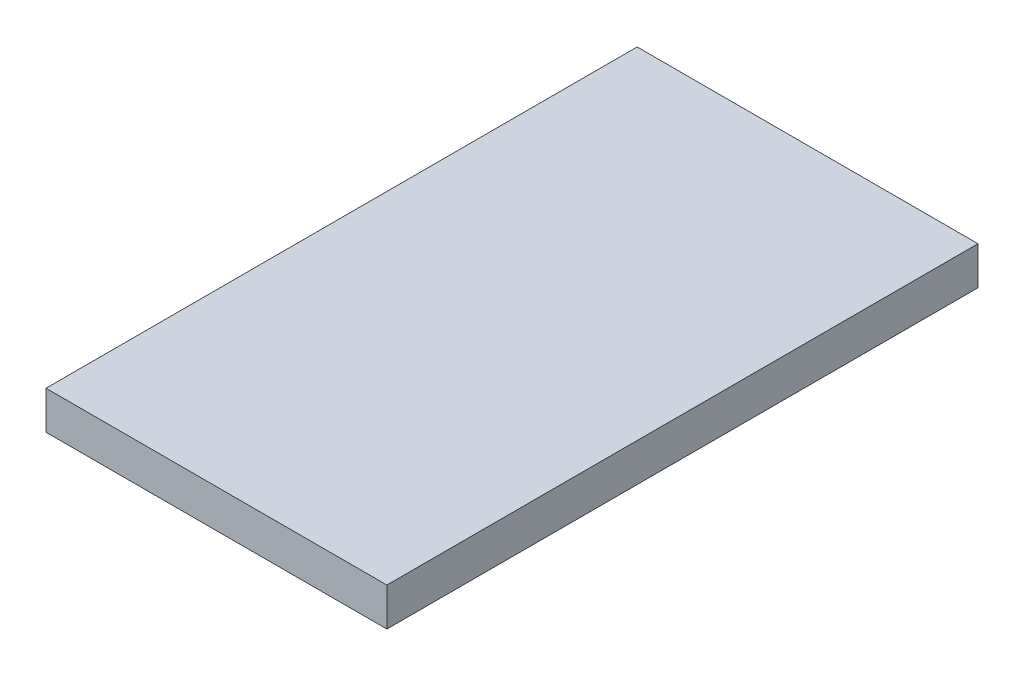
ISO-10303-21;
HEADER;
FILE_DESCRIPTION(('STEP AP214'),'2;1');
FILE_NAME('part.step','',(''),(''),'','','');
FILE_SCHEMA(('AUTOMOTIVE_DESIGN { 1 0 10303 214 1 1 1 1 }'));
ENDSEC;
DATA;
#1=APPLICATION_CONTEXT('core data for automotive mechanical design processes');
#2=APPLICATION_PROTOCOL_DEFINITION('international standard','automotive_design',2000,#1);
#3=PRODUCT_CONTEXT('',#1,'mechanical');
#4=PRODUCT('Part','Part','',(#3));
#5=PRODUCT_RELATED_PRODUCT_CATEGORY('part','',(#4));
#6=PRODUCT_DEFINITION_FORMATION('','',#4);
#7=PRODUCT_DEFINITION_CONTEXT('part definition',#1,'design');
#8=PRODUCT_DEFINITION('design','',#6,#7);
#9=PRODUCT_DEFINITION_SHAPE('','',#8);
#10=(LENGTH_UNIT() NAMED_UNIT(*) SI_UNIT(.MILLI.,.METRE.));
#11=(NAMED_UNIT(*) PLANE_ANGLE_UNIT() SI_UNIT($,.RADIAN.));
#12=(NAMED_UNIT(*) SI_UNIT($,.STERADIAN.) SOLID_ANGLE_UNIT());
#13=UNCERTAINTY_MEASURE_WITH_UNIT(LENGTH_MEASURE(1.E-05),#10,'distance_accuracy_value','');
#14=(GEOMETRIC_REPRESENTATION_CONTEXT(3) GLOBAL_UNCERTAINTY_ASSIGNED_CONTEXT((#13)) GLOBAL_UNIT_ASSIGNED_CONTEXT((#10,
#11,#12)) REPRESENTATION_CONTEXT('',''));
#15=CARTESIAN_POINT('',(0.,0.,0.));
#16=DIRECTION('',(0.,0.,1.));
#17=DIRECTION('',(1.,0.,0.));
#18=AXIS2_PLACEMENT_3D('',#15,#16,#17);
#19=CARTESIAN_POINT('',(-7.15,1.6,-12.4));
#20=DIRECTION('',(1.,0.,0.));
#21=DIRECTION('',(0.,0.,-1.));
#22=AXIS2_PLACEMENT_3D('',#19,#20,#21);
#23=PLANE('',#22);
#24=DIRECTION('',(0.,0.,1.));
#25=VECTOR('',#24,1.);
#26=CARTESIAN_POINT('',(-7.15,0.,-12.4));
#27=LINE('',#26,#25);
#28=CARTESIAN_POINT('',(-7.15,0.,-12.4));
#29=VERTEX_POINT('',#28);
#30=CARTESIAN_POINT('',(-7.15,0.,12.4));
#31=VERTEX_POINT('',#30);
#32=EDGE_CURVE('E99',#29,#31,#27,.T.);
#33=ORIENTED_EDGE('',*,*,#32,.T.);
#34=DIRECTION('',(0.,-1.,0.));
#35=VECTOR('',#34,1.);
#36=CARTESIAN_POINT('',(-7.15,1.6,12.4));
#37=LINE('',#36,#35);
#38=CARTESIAN_POINT('',(-7.15,1.6,12.4));
#39=VERTEX_POINT('',#38);
#40=EDGE_CURVE('E11',#39,#31,#37,.T.);
#41=ORIENTED_EDGE('',*,*,#40,.F.);
#42=DIRECTION('',(0.,0.,1.));
#43=VECTOR('',#42,1.);
#44=CARTESIAN_POINT('',(-7.15,1.6,-12.4));
#45=LINE('',#44,#43);
#46=CARTESIAN_POINT('',(-7.15,1.6,-12.4));
#47=VERTEX_POINT('',#46);
#48=EDGE_CURVE('E87',#47,#39,#45,.T.);
#49=ORIENTED_EDGE('',*,*,#48,.F.);
#50=DIRECTION('',(0.,-1.,0.));
#51=VECTOR('',#50,1.);
#52=CARTESIAN_POINT('',(-7.15,1.6,-12.4));
#53=LINE('',#52,#51);
#54=EDGE_CURVE('E95',#47,#29,#53,.T.);
#55=ORIENTED_EDGE('',*,*,#54,.T.);
#56=EDGE_LOOP('',(#33,#41,#49,#55));
#57=FACE_BOUND('',#56,.T.);
#58=ADVANCED_FACE('F36',(#57),#23,.F.);
#59=CARTESIAN_POINT('',(-7.15,1.6,12.4));
#60=DIRECTION('',(0.,0.,-1.));
#61=DIRECTION('',(-1.,0.,0.));
#62=AXIS2_PLACEMENT_3D('',#59,#60,#61);
#63=PLANE('',#62);
#64=DIRECTION('',(1.,0.,0.));
#65=VECTOR('',#64,1.);
#66=CARTESIAN_POINT('',(-7.15,0.,12.4));
#67=LINE('',#66,#65);
#68=CARTESIAN_POINT('',(7.15000000000001,0.,12.4));
#69=VERTEX_POINT('',#68);
#70=EDGE_CURVE('E91',#31,#69,#67,.T.);
#71=ORIENTED_EDGE('',*,*,#70,.T.);
#72=DIRECTION('',(0.,-1.,0.));
#73=VECTOR('',#72,1.);
#74=CARTESIAN_POINT('',(7.15000000000001,1.6,12.4));
#75=LINE('',#74,#73);
#76=CARTESIAN_POINT('',(7.15000000000001,1.6,12.4));
#77=VERTEX_POINT('',#76);
#78=EDGE_CURVE('E44',#77,#69,#75,.T.);
#79=ORIENTED_EDGE('',*,*,#78,.F.);
#80=DIRECTION('',(1.,0.,0.));
#81=VECTOR('',#80,1.);
#82=CARTESIAN_POINT('',(-7.15,1.6,12.4));
#83=LINE('',#82,#81);
#84=EDGE_CURVE('E82',#39,#77,#83,.T.);
#85=ORIENTED_EDGE('',*,*,#84,.F.);
#86=ORIENTED_EDGE('',*,*,#40,.T.);
#87=EDGE_LOOP('',(#71,#79,#85,#86));
#88=FACE_BOUND('',#87,.T.);
#89=ADVANCED_FACE('F90',(#88),#63,.F.);
#90=CARTESIAN_POINT('',(7.15,1.6,-12.4));
#91=DIRECTION('',(-1.,0.,0.));
#92=DIRECTION('',(0.,0.,1.));
#93=AXIS2_PLACEMENT_3D('',#90,#91,#92);
#94=PLANE('',#93);
#95=DIRECTION('',(0.,0.,-1.));
#96=VECTOR('',#95,1.);
#97=CARTESIAN_POINT('',(7.15,0.,-12.4));
#98=LINE('',#97,#96);
#99=CARTESIAN_POINT('',(7.15,0.,-12.4));
#100=VERTEX_POINT('',#99);
#101=EDGE_CURVE('E69',#69,#100,#98,.T.);
#102=ORIENTED_EDGE('',*,*,#101,.T.);
#103=DIRECTION('',(0.,-1.,0.));
#104=VECTOR('',#103,1.);
#105=CARTESIAN_POINT('',(7.15,1.6,-12.4));
#106=LINE('',#105,#104);
#107=CARTESIAN_POINT('',(7.15,1.6,-12.4));
#108=VERTEX_POINT('',#107);
#109=EDGE_CURVE('E92',#108,#100,#106,.T.);
#110=ORIENTED_EDGE('',*,*,#109,.F.);
#111=DIRECTION('',(0.,0.,-1.));
#112=VECTOR('',#111,1.);
#113=CARTESIAN_POINT('',(7.15,1.6,-12.4));
#114=LINE('',#113,#112);
#115=EDGE_CURVE('E85',#77,#108,#114,.T.);
#116=ORIENTED_EDGE('',*,*,#115,.F.);
#117=ORIENTED_EDGE('',*,*,#78,.T.);
#118=EDGE_LOOP('',(#102,#110,#116,#117));
#119=FACE_BOUND('',#118,.T.);
#120=ADVANCED_FACE('F93',(#119),#94,.F.);
#121=CARTESIAN_POINT('',(-7.15,1.6,-12.4));
#122=DIRECTION('',(0.,0.,1.));
#123=DIRECTION('',(1.,0.,0.));
#124=AXIS2_PLACEMENT_3D('',#121,#122,#123);
#125=PLANE('',#124);
#126=DIRECTION('',(-1.,0.,0.));
#127=VECTOR('',#126,1.);
#128=CARTESIAN_POINT('',(-7.15,0.,-12.4));
#129=LINE('',#128,#127);
#130=EDGE_CURVE('E75',#100,#29,#129,.T.);
#131=ORIENTED_EDGE('',*,*,#130,.T.);
#132=ORIENTED_EDGE('',*,*,#54,.F.);
#133=DIRECTION('',(-1.,0.,0.));
#134=VECTOR('',#133,1.);
#135=CARTESIAN_POINT('',(-7.15,1.6,-12.4));
#136=LINE('',#135,#134);
#137=EDGE_CURVE('E52',#108,#47,#136,.T.);
#138=ORIENTED_EDGE('',*,*,#137,.F.);
#139=ORIENTED_EDGE('',*,*,#109,.T.);
#140=EDGE_LOOP('',(#131,#132,#138,#139));
#141=FACE_BOUND('',#140,.T.);
#142=ADVANCED_FACE('F106',(#141),#125,.F.);
#143=CARTESIAN_POINT('',(0.,1.6,0.));
#144=DIRECTION('',(0.,1.,0.));
#145=DIRECTION('',(0.,0.,1.));
#146=AXIS2_PLACEMENT_3D('',#143,#144,#145);
#147=PLANE('',#146);
#148=ORIENTED_EDGE('',*,*,#48,.T.);
#149=ORIENTED_EDGE('',*,*,#84,.T.);
#150=ORIENTED_EDGE('',*,*,#115,.T.);
#151=ORIENTED_EDGE('',*,*,#137,.T.);
#152=EDGE_LOOP('',(#148,#149,#150,#151));
#153=FACE_BOUND('',#152,.T.);
#154=ADVANCED_FACE('F83',(#153),#147,.T.);
#155=CARTESIAN_POINT('',(0.,0.,0.));
#156=DIRECTION('',(0.,1.,0.));
#157=DIRECTION('',(0.,0.,1.));
#158=AXIS2_PLACEMENT_3D('',#155,#156,#157);
#159=PLANE('',#158);
#160=ORIENTED_EDGE('',*,*,#32,.F.);
#161=ORIENTED_EDGE('',*,*,#130,.F.);
#162=ORIENTED_EDGE('',*,*,#101,.F.);
#163=ORIENTED_EDGE('',*,*,#70,.F.);
#164=EDGE_LOOP('',(#160,#161,#162,#163));
#165=FACE_BOUND('',#164,.T.);
#166=ADVANCED_FACE('F109',(#165),#159,.F.);
#167=CLOSED_SHELL('',(#58,#89,#120,#142,#154,#166));
#168=MANIFOLD_SOLID_BREP('B2',#167);
#169=ADVANCED_BREP_SHAPE_REPRESENTATION('',(#18,#168),#14);
#170=SHAPE_DEFINITION_REPRESENTATION(#9,#169);
ENDSEC;
END-ISO-10303-21;
